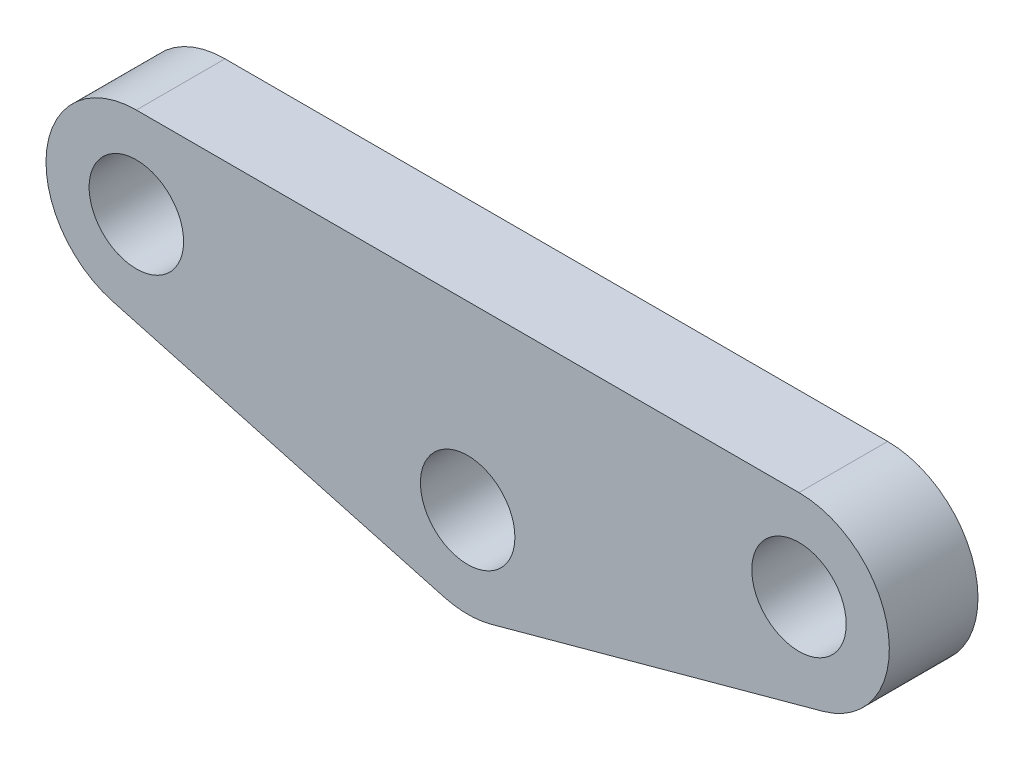
ISO-10303-21;
HEADER;
FILE_DESCRIPTION(('STEP AP214'),'2;1');
FILE_NAME('part.step','',(''),(''),'','','');
FILE_SCHEMA(('AUTOMOTIVE_DESIGN { 1 0 10303 214 1 1 1 1 }'));
ENDSEC;
DATA;
#1=APPLICATION_CONTEXT('core data for automotive mechanical design processes');
#2=APPLICATION_PROTOCOL_DEFINITION('international standard','automotive_design',2000,#1);
#3=PRODUCT_CONTEXT('',#1,'mechanical');
#4=PRODUCT('Part','Part','',(#3));
#5=PRODUCT_RELATED_PRODUCT_CATEGORY('part','',(#4));
#6=PRODUCT_DEFINITION_FORMATION('','',#4);
#7=PRODUCT_DEFINITION_CONTEXT('part definition',#1,'design');
#8=PRODUCT_DEFINITION('design','',#6,#7);
#9=PRODUCT_DEFINITION_SHAPE('','',#8);
#10=(LENGTH_UNIT() NAMED_UNIT(*) SI_UNIT(.MILLI.,.METRE.));
#11=(NAMED_UNIT(*) PLANE_ANGLE_UNIT() SI_UNIT($,.RADIAN.));
#12=(NAMED_UNIT(*) SI_UNIT($,.STERADIAN.) SOLID_ANGLE_UNIT());
#13=UNCERTAINTY_MEASURE_WITH_UNIT(LENGTH_MEASURE(1.E-05),#10,'distance_accuracy_value','');
#14=(GEOMETRIC_REPRESENTATION_CONTEXT(3) GLOBAL_UNCERTAINTY_ASSIGNED_CONTEXT((#13)) GLOBAL_UNIT_ASSIGNED_CONTEXT((#10,
#11,#12)) REPRESENTATION_CONTEXT('',''));
#15=CARTESIAN_POINT('',(0.,0.,0.));
#16=DIRECTION('',(0.,0.,1.));
#17=DIRECTION('',(1.,0.,0.));
#18=AXIS2_PLACEMENT_3D('',#15,#16,#17);
#19=CARTESIAN_POINT('',(134.937753817117,250.8885,2.3368));
#20=DIRECTION('',(0.,0.,1.));
#21=DIRECTION('',(1.,0.,0.));
#22=AXIS2_PLACEMENT_3D('',#19,#20,#21);
#23=PLANE('',#22);
#24=CARTESIAN_POINT('',(152.4,246.126,2.3368));
#25=DIRECTION('',(0.,0.,1.));
#26=DIRECTION('',(1.,0.,0.));
#27=AXIS2_PLACEMENT_3D('',#24,#25,#26);
#28=CIRCLE('',#27,2.48920000000001);
#29=CARTESIAN_POINT('',(154.8892,246.126,2.3368));
#30=VERTEX_POINT('',#29);
#31=EDGE_CURVE('E188',#30,#30,#28,.T.);
#32=ORIENTED_EDGE('',*,*,#31,.F.);
#33=EDGE_LOOP('',(#32));
#34=FACE_BOUND('',#33,.T.);
#35=CARTESIAN_POINT('',(134.937753817117,250.8885,2.3368));
#36=DIRECTION('',(0.,0.,1.));
#37=DIRECTION('',(1.,0.,0.));
#38=AXIS2_PLACEMENT_3D('',#35,#36,#37);
#39=CIRCLE('',#38,4.76249999999998);
#40=CARTESIAN_POINT('',(134.937753817117,255.651,2.3368));
#41=VERTEX_POINT('',#40);
#42=CARTESIAN_POINT('',(133.684640219026,246.293816924936,2.3368));
#43=VERTEX_POINT('',#42);
#44=EDGE_CURVE('E133',#41,#43,#39,.T.);
#45=ORIENTED_EDGE('',*,*,#44,.T.);
#46=DIRECTION('',(0.964762850407108,-0.263120965478526,0.));
#47=VECTOR('',#46,1.);
#48=CARTESIAN_POINT('',(133.684640219026,246.293816924936,2.3368));
#49=LINE('',#48,#47);
#50=CARTESIAN_POINT('',(151.146886401908,241.531316924936,2.3368));
#51=VERTEX_POINT('',#50);
#52=EDGE_CURVE('E91',#43,#51,#49,.T.);
#53=ORIENTED_EDGE('',*,*,#52,.T.);
#54=CARTESIAN_POINT('',(152.4,246.126,2.3368));
#55=DIRECTION('',(0.,0.,1.));
#56=DIRECTION('',(1.,0.,0.));
#57=AXIS2_PLACEMENT_3D('',#54,#55,#56);
#58=CIRCLE('',#57,4.76249999999995);
#59=CARTESIAN_POINT('',(153.653113598091,241.531316924936,2.3368));
#60=VERTEX_POINT('',#59);
#61=EDGE_CURVE('E104',#51,#60,#58,.T.);
#62=ORIENTED_EDGE('',*,*,#61,.T.);
#63=DIRECTION('',(0.964762850407107,0.263120965478529,0.));
#64=VECTOR('',#63,1.);
#65=CARTESIAN_POINT('',(171.115359780974,246.293816924936,2.3368));
#66=LINE('',#65,#64);
#67=CARTESIAN_POINT('',(171.115359780974,246.293816924936,2.3368));
#68=VERTEX_POINT('',#67);
#69=EDGE_CURVE('E98',#60,#68,#66,.T.);
#70=ORIENTED_EDGE('',*,*,#69,.T.);
#71=CARTESIAN_POINT('',(169.862246182883,250.8885,2.3368));
#72=DIRECTION('',(0.,0.,1.));
#73=DIRECTION('',(1.,0.,0.));
#74=AXIS2_PLACEMENT_3D('',#71,#72,#73);
#75=CIRCLE('',#74,4.76249999999995);
#76=CARTESIAN_POINT('',(169.862246182883,255.651,2.3368));
#77=VERTEX_POINT('',#76);
#78=EDGE_CURVE('E102',#68,#77,#75,.T.);
#79=ORIENTED_EDGE('',*,*,#78,.T.);
#80=DIRECTION('',(-1.,0.,0.));
#81=VECTOR('',#80,1.);
#82=CARTESIAN_POINT('',(134.937753817117,255.651,2.3368));
#83=LINE('',#82,#81);
#84=EDGE_CURVE('E54',#77,#41,#83,.T.);
#85=ORIENTED_EDGE('',*,*,#84,.T.);
#86=EDGE_LOOP('',(#45,#53,#62,#70,#79,#85));
#87=FACE_BOUND('',#86,.T.);
#88=CARTESIAN_POINT('',(169.862246182883,250.8885,2.3368));
#89=DIRECTION('',(0.,0.,1.));
#90=DIRECTION('',(1.,0.,0.));
#91=AXIS2_PLACEMENT_3D('',#88,#89,#90);
#92=CIRCLE('',#91,2.48920000000001);
#93=CARTESIAN_POINT('',(172.351446182883,250.8885,2.3368));
#94=VERTEX_POINT('',#93);
#95=EDGE_CURVE('E126',#94,#94,#92,.T.);
#96=ORIENTED_EDGE('',*,*,#95,.F.);
#97=EDGE_LOOP('',(#96));
#98=FACE_BOUND('',#97,.T.);
#99=CARTESIAN_POINT('',(134.937753817117,250.8885,2.3368));
#100=DIRECTION('',(0.,0.,1.));
#101=DIRECTION('',(1.,0.,0.));
#102=AXIS2_PLACEMENT_3D('',#99,#100,#101);
#103=CIRCLE('',#102,2.48920000000001);
#104=CARTESIAN_POINT('',(137.426953817117,250.8885,2.3368));
#105=VERTEX_POINT('',#104);
#106=EDGE_CURVE('E179',#105,#105,#103,.T.);
#107=ORIENTED_EDGE('',*,*,#106,.F.);
#108=EDGE_LOOP('',(#107));
#109=FACE_BOUND('',#108,.T.);
#110=ADVANCED_FACE('F37',(#34,#87,#98,#109),#23,.T.);
#111=CARTESIAN_POINT('',(134.937753817117,250.8885,-2.3368));
#112=DIRECTION('',(0.,0.,1.));
#113=DIRECTION('',(1.,0.,0.));
#114=AXIS2_PLACEMENT_3D('',#111,#112,#113);
#115=PLANE('',#114);
#116=CARTESIAN_POINT('',(134.937753817117,250.8885,-2.3368));
#117=DIRECTION('',(0.,0.,1.));
#118=DIRECTION('',(1.,0.,0.));
#119=AXIS2_PLACEMENT_3D('',#116,#117,#118);
#120=CIRCLE('',#119,4.76249999999998);
#121=CARTESIAN_POINT('',(134.937753817117,255.651,-2.3368));
#122=VERTEX_POINT('',#121);
#123=CARTESIAN_POINT('',(133.684640219026,246.293816924936,-2.3368));
#124=VERTEX_POINT('',#123);
#125=EDGE_CURVE('E122',#122,#124,#120,.T.);
#126=ORIENTED_EDGE('',*,*,#125,.F.);
#127=DIRECTION('',(-1.,0.,0.));
#128=VECTOR('',#127,1.);
#129=CARTESIAN_POINT('',(134.937753817117,255.651,-2.3368));
#130=LINE('',#129,#128);
#131=CARTESIAN_POINT('',(169.862246182883,255.651,-2.3368));
#132=VERTEX_POINT('',#131);
#133=EDGE_CURVE('E83',#132,#122,#130,.T.);
#134=ORIENTED_EDGE('',*,*,#133,.F.);
#135=CARTESIAN_POINT('',(169.862246182883,250.8885,-2.3368));
#136=DIRECTION('',(0.,0.,1.));
#137=DIRECTION('',(1.,0.,0.));
#138=AXIS2_PLACEMENT_3D('',#135,#136,#137);
#139=CIRCLE('',#138,4.76249999999995);
#140=CARTESIAN_POINT('',(171.115359780974,246.293816924936,-2.3368));
#141=VERTEX_POINT('',#140);
#142=EDGE_CURVE('E77',#141,#132,#139,.T.);
#143=ORIENTED_EDGE('',*,*,#142,.F.);
#144=DIRECTION('',(0.964762850407107,0.263120965478529,0.));
#145=VECTOR('',#144,1.);
#146=CARTESIAN_POINT('',(171.115359780974,246.293816924936,-2.3368));
#147=LINE('',#146,#145);
#148=CARTESIAN_POINT('',(153.653113598091,241.531316924936,-2.3368));
#149=VERTEX_POINT('',#148);
#150=EDGE_CURVE('E112',#149,#141,#147,.T.);
#151=ORIENTED_EDGE('',*,*,#150,.F.);
#152=CARTESIAN_POINT('',(152.4,246.126,-2.3368));
#153=DIRECTION('',(0.,0.,1.));
#154=DIRECTION('',(1.,0.,0.));
#155=AXIS2_PLACEMENT_3D('',#152,#153,#154);
#156=CIRCLE('',#155,4.76249999999995);
#157=CARTESIAN_POINT('',(151.146886401908,241.531316924936,-2.3368));
#158=VERTEX_POINT('',#157);
#159=EDGE_CURVE('E128',#158,#149,#156,.T.);
#160=ORIENTED_EDGE('',*,*,#159,.F.);
#161=DIRECTION('',(0.964762850407108,-0.263120965478526,0.));
#162=VECTOR('',#161,1.);
#163=CARTESIAN_POINT('',(133.684640219026,246.293816924936,-2.3368));
#164=LINE('',#163,#162);
#165=EDGE_CURVE('E125',#124,#158,#164,.T.);
#166=ORIENTED_EDGE('',*,*,#165,.F.);
#167=EDGE_LOOP('',(#126,#134,#143,#151,#160,#166));
#168=FACE_BOUND('',#167,.T.);
#169=CARTESIAN_POINT('',(169.862246182883,250.8885,-2.3368));
#170=DIRECTION('',(0.,0.,1.));
#171=DIRECTION('',(1.,0.,0.));
#172=AXIS2_PLACEMENT_3D('',#169,#170,#171);
#173=CIRCLE('',#172,2.48920000000001);
#174=CARTESIAN_POINT('',(172.351446182883,250.8885,-2.3368));
#175=VERTEX_POINT('',#174);
#176=EDGE_CURVE('E191',#175,#175,#173,.T.);
#177=ORIENTED_EDGE('',*,*,#176,.T.);
#178=EDGE_LOOP('',(#177));
#179=FACE_BOUND('',#178,.T.);
#180=CARTESIAN_POINT('',(152.4,246.126,-2.3368));
#181=DIRECTION('',(0.,0.,1.));
#182=DIRECTION('',(1.,0.,0.));
#183=AXIS2_PLACEMENT_3D('',#180,#181,#182);
#184=CIRCLE('',#183,2.48920000000001);
#185=CARTESIAN_POINT('',(154.8892,246.126,-2.3368));
#186=VERTEX_POINT('',#185);
#187=EDGE_CURVE('E185',#186,#186,#184,.T.);
#188=ORIENTED_EDGE('',*,*,#187,.T.);
#189=EDGE_LOOP('',(#188));
#190=FACE_BOUND('',#189,.T.);
#191=CARTESIAN_POINT('',(134.937753817117,250.8885,-2.3368));
#192=DIRECTION('',(0.,0.,1.));
#193=DIRECTION('',(1.,0.,0.));
#194=AXIS2_PLACEMENT_3D('',#191,#192,#193);
#195=CIRCLE('',#194,2.48920000000001);
#196=CARTESIAN_POINT('',(137.426953817117,250.8885,-2.3368));
#197=VERTEX_POINT('',#196);
#198=EDGE_CURVE('E182',#197,#197,#195,.T.);
#199=ORIENTED_EDGE('',*,*,#198,.T.);
#200=EDGE_LOOP('',(#199));
#201=FACE_BOUND('',#200,.T.);
#202=ADVANCED_FACE('F142',(#168,#179,#190,#201),#115,.F.);
#203=CARTESIAN_POINT('',(134.937753817117,250.8885,2.3368));
#204=DIRECTION('',(0.,0.,-1.));
#205=DIRECTION('',(-1.,0.,0.));
#206=AXIS2_PLACEMENT_3D('',#203,#204,#205);
#207=CYLINDRICAL_SURFACE('',#206,4.76249999999998);
#208=ORIENTED_EDGE('',*,*,#125,.T.);
#209=DIRECTION('',(0.,0.,-1.));
#210=VECTOR('',#209,1.);
#211=CARTESIAN_POINT('',(133.684640219026,246.293816924936,2.3368));
#212=LINE('',#211,#210);
#213=EDGE_CURVE('E11',#43,#124,#212,.T.);
#214=ORIENTED_EDGE('',*,*,#213,.F.);
#215=ORIENTED_EDGE('',*,*,#44,.F.);
#216=DIRECTION('',(0.,0.,-1.));
#217=VECTOR('',#216,1.);
#218=CARTESIAN_POINT('',(134.937753817117,255.651,2.3368));
#219=LINE('',#218,#217);
#220=EDGE_CURVE('E118',#41,#122,#219,.T.);
#221=ORIENTED_EDGE('',*,*,#220,.T.);
#222=EDGE_LOOP('',(#208,#214,#215,#221));
#223=FACE_BOUND('',#222,.T.);
#224=ADVANCED_FACE('F39',(#223),#207,.T.);
#225=CARTESIAN_POINT('',(133.684640219026,246.293816924936,2.3368));
#226=DIRECTION('',(0.263120965478526,0.964762850407108,0.));
#227=DIRECTION('',(-0.964762850407108,0.263120965478526,0.));
#228=AXIS2_PLACEMENT_3D('',#225,#226,#227);
#229=PLANE('',#228);
#230=ORIENTED_EDGE('',*,*,#165,.T.);
#231=DIRECTION('',(0.,0.,-1.));
#232=VECTOR('',#231,1.);
#233=CARTESIAN_POINT('',(151.146886401908,241.531316924936,2.3368));
#234=LINE('',#233,#232);
#235=EDGE_CURVE('E46',#51,#158,#234,.T.);
#236=ORIENTED_EDGE('',*,*,#235,.F.);
#237=ORIENTED_EDGE('',*,*,#52,.F.);
#238=ORIENTED_EDGE('',*,*,#213,.T.);
#239=EDGE_LOOP('',(#230,#236,#237,#238));
#240=FACE_BOUND('',#239,.T.);
#241=ADVANCED_FACE('F245',(#240),#229,.F.);
#242=CARTESIAN_POINT('',(152.4,246.126,2.3368));
#243=DIRECTION('',(0.,0.,-1.));
#244=DIRECTION('',(-1.,0.,0.));
#245=AXIS2_PLACEMENT_3D('',#242,#243,#244);
#246=CYLINDRICAL_SURFACE('',#245,4.76249999999995);
#247=ORIENTED_EDGE('',*,*,#159,.T.);
#248=DIRECTION('',(0.,0.,-1.));
#249=VECTOR('',#248,1.);
#250=CARTESIAN_POINT('',(153.653113598091,241.531316924936,2.3368));
#251=LINE('',#250,#249);
#252=EDGE_CURVE('E113',#60,#149,#251,.T.);
#253=ORIENTED_EDGE('',*,*,#252,.F.);
#254=ORIENTED_EDGE('',*,*,#61,.F.);
#255=ORIENTED_EDGE('',*,*,#235,.T.);
#256=EDGE_LOOP('',(#247,#253,#254,#255));
#257=FACE_BOUND('',#256,.T.);
#258=ADVANCED_FACE('F139',(#257),#246,.T.);
#259=CARTESIAN_POINT('',(171.115359780974,246.293816924936,2.3368));
#260=DIRECTION('',(-0.263120965478529,0.964762850407107,0.));
#261=DIRECTION('',(-0.964762850407107,-0.263120965478529,0.));
#262=AXIS2_PLACEMENT_3D('',#259,#260,#261);
#263=PLANE('',#262);
#264=ORIENTED_EDGE('',*,*,#150,.T.);
#265=DIRECTION('',(0.,0.,-1.));
#266=VECTOR('',#265,1.);
#267=CARTESIAN_POINT('',(171.115359780974,246.293816924936,2.3368));
#268=LINE('',#267,#266);
#269=EDGE_CURVE('E109',#68,#141,#268,.T.);
#270=ORIENTED_EDGE('',*,*,#269,.F.);
#271=ORIENTED_EDGE('',*,*,#69,.F.);
#272=ORIENTED_EDGE('',*,*,#252,.T.);
#273=EDGE_LOOP('',(#264,#270,#271,#272));
#274=FACE_BOUND('',#273,.T.);
#275=ADVANCED_FACE('F110',(#274),#263,.F.);
#276=CARTESIAN_POINT('',(169.862246182883,250.8885,2.3368));
#277=DIRECTION('',(0.,0.,-1.));
#278=DIRECTION('',(-1.,0.,0.));
#279=AXIS2_PLACEMENT_3D('',#276,#277,#278);
#280=CYLINDRICAL_SURFACE('',#279,4.76249999999995);
#281=ORIENTED_EDGE('',*,*,#142,.T.);
#282=DIRECTION('',(0.,0.,-1.));
#283=VECTOR('',#282,1.);
#284=CARTESIAN_POINT('',(169.862246182883,255.651,2.3368));
#285=LINE('',#284,#283);
#286=EDGE_CURVE('E114',#77,#132,#285,.T.);
#287=ORIENTED_EDGE('',*,*,#286,.F.);
#288=ORIENTED_EDGE('',*,*,#78,.F.);
#289=ORIENTED_EDGE('',*,*,#269,.T.);
#290=EDGE_LOOP('',(#281,#287,#288,#289));
#291=FACE_BOUND('',#290,.T.);
#292=ADVANCED_FACE('F116',(#291),#280,.T.);
#293=CARTESIAN_POINT('',(134.937753817117,255.651,2.3368));
#294=DIRECTION('',(0.,-1.,0.));
#295=DIRECTION('',(0.,0.,-1.));
#296=AXIS2_PLACEMENT_3D('',#293,#294,#295);
#297=PLANE('',#296);
#298=ORIENTED_EDGE('',*,*,#133,.T.);
#299=ORIENTED_EDGE('',*,*,#220,.F.);
#300=ORIENTED_EDGE('',*,*,#84,.F.);
#301=ORIENTED_EDGE('',*,*,#286,.T.);
#302=EDGE_LOOP('',(#298,#299,#300,#301));
#303=FACE_BOUND('',#302,.T.);
#304=ADVANCED_FACE('F147',(#303),#297,.F.);
#305=CARTESIAN_POINT('',(169.862246182883,250.8885,2.3368));
#306=DIRECTION('',(0.,0.,-1.));
#307=DIRECTION('',(-1.,0.,0.));
#308=AXIS2_PLACEMENT_3D('',#305,#306,#307);
#309=CYLINDRICAL_SURFACE('',#308,2.48920000000001);
#310=ORIENTED_EDGE('',*,*,#95,.T.);
#311=EDGE_LOOP('',(#310));
#312=FACE_BOUND('',#311,.T.);
#313=ORIENTED_EDGE('',*,*,#176,.F.);
#314=EDGE_LOOP('',(#313));
#315=FACE_BOUND('',#314,.T.);
#316=ADVANCED_FACE('F149',(#312,#315),#309,.F.);
#317=CARTESIAN_POINT('',(152.4,246.126,2.3368));
#318=DIRECTION('',(0.,0.,-1.));
#319=DIRECTION('',(-1.,0.,0.));
#320=AXIS2_PLACEMENT_3D('',#317,#318,#319);
#321=CYLINDRICAL_SURFACE('',#320,2.48920000000001);
#322=ORIENTED_EDGE('',*,*,#31,.T.);
#323=EDGE_LOOP('',(#322));
#324=FACE_BOUND('',#323,.T.);
#325=ORIENTED_EDGE('',*,*,#187,.F.);
#326=EDGE_LOOP('',(#325));
#327=FACE_BOUND('',#326,.T.);
#328=ADVANCED_FACE('F155',(#324,#327),#321,.F.);
#329=CARTESIAN_POINT('',(134.937753817117,250.8885,2.3368));
#330=DIRECTION('',(0.,0.,-1.));
#331=DIRECTION('',(-1.,0.,0.));
#332=AXIS2_PLACEMENT_3D('',#329,#330,#331);
#333=CYLINDRICAL_SURFACE('',#332,2.48920000000001);
#334=ORIENTED_EDGE('',*,*,#106,.T.);
#335=EDGE_LOOP('',(#334));
#336=FACE_BOUND('',#335,.T.);
#337=ORIENTED_EDGE('',*,*,#198,.F.);
#338=EDGE_LOOP('',(#337));
#339=FACE_BOUND('',#338,.T.);
#340=ADVANCED_FACE('F170',(#336,#339),#333,.F.);
#341=CLOSED_SHELL('',(#110,#202,#224,#241,#258,#275,#292,#304,#316,#328,#340));
#342=MANIFOLD_SOLID_BREP('B2',#341);
#343=ADVANCED_BREP_SHAPE_REPRESENTATION('',(#18,#342),#14);
#344=SHAPE_DEFINITION_REPRESENTATION(#9,#343);
ENDSEC;
END-ISO-10303-21;
